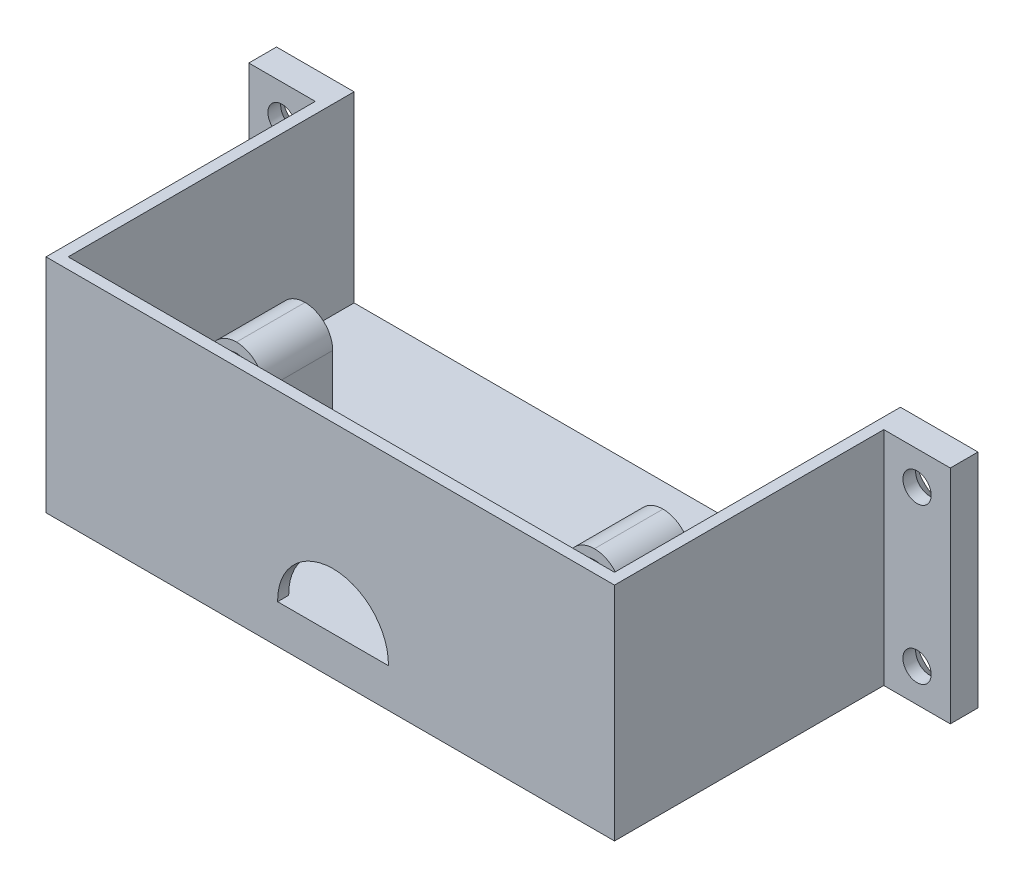
ISO-10303-21;
HEADER;
FILE_DESCRIPTION(('STEP AP214'),'2;1');
FILE_NAME('part.step','',(''),(''),'','','');
FILE_SCHEMA(('AUTOMOTIVE_DESIGN { 1 0 10303 214 1 1 1 1 }'));
ENDSEC;
DATA;
#1=APPLICATION_CONTEXT('core data for automotive mechanical design processes');
#2=APPLICATION_PROTOCOL_DEFINITION('international standard','automotive_design',2000,#1);
#3=PRODUCT_CONTEXT('',#1,'mechanical');
#4=PRODUCT('Part','Part','',(#3));
#5=PRODUCT_RELATED_PRODUCT_CATEGORY('part','',(#4));
#6=PRODUCT_DEFINITION_FORMATION('','',#4);
#7=PRODUCT_DEFINITION_CONTEXT('part definition',#1,'design');
#8=PRODUCT_DEFINITION('design','',#6,#7);
#9=PRODUCT_DEFINITION_SHAPE('','',#8);
#10=(LENGTH_UNIT() NAMED_UNIT(*) SI_UNIT(.MILLI.,.METRE.));
#11=(NAMED_UNIT(*) PLANE_ANGLE_UNIT() SI_UNIT($,.RADIAN.));
#12=(NAMED_UNIT(*) SI_UNIT($,.STERADIAN.) SOLID_ANGLE_UNIT());
#13=UNCERTAINTY_MEASURE_WITH_UNIT(LENGTH_MEASURE(1.E-05),#10,'distance_accuracy_value','');
#14=(GEOMETRIC_REPRESENTATION_CONTEXT(3) GLOBAL_UNCERTAINTY_ASSIGNED_CONTEXT((#13)) GLOBAL_UNIT_ASSIGNED_CONTEXT((#10,
#11,#12)) REPRESENTATION_CONTEXT('',''));
#15=CARTESIAN_POINT('',(0.,0.,0.));
#16=DIRECTION('',(0.,0.,1.));
#17=DIRECTION('',(1.,0.,0.));
#18=AXIS2_PLACEMENT_3D('',#15,#16,#17);
#19=CARTESIAN_POINT('',(0.,0.,-0.0001));
#20=DIRECTION('',(0.,0.,1.));
#21=DIRECTION('',(1.,0.,0.));
#22=AXIS2_PLACEMENT_3D('',#19,#20,#21);
#23=PLANE('',#22);
#24=CARTESIAN_POINT('',(91.1321703939799,13.1867469879518,-0.000100000000001735));
#25=DIRECTION('',(0.,0.,-1.));
#26=DIRECTION('',(-1.,0.,0.));
#27=AXIS2_PLACEMENT_3D('',#24,#25,#26);
#28=CIRCLE('',#27,5.250000041);
#29=CARTESIAN_POINT('',(85.8821703529799,13.1867469879518,-0.000100000000001735));
#30=VERTEX_POINT('',#29);
#31=EDGE_CURVE('E960',#30,#30,#28,.T.);
#32=ORIENTED_EDGE('',*,*,#31,.F.);
#33=EDGE_LOOP('',(#32));
#34=FACE_BOUND('',#33,.T.);
#35=CARTESIAN_POINT('',(-23.4678296060201,13.1867469879518,-0.000100000000001735));
#36=DIRECTION('',(0.,0.,-1.));
#37=DIRECTION('',(-1.,0.,0.));
#38=AXIS2_PLACEMENT_3D('',#35,#36,#37);
#39=CIRCLE('',#38,5.250000041);
#40=CARTESIAN_POINT('',(-28.7178296470201,13.1867469879518,-0.000100000000001735));
#41=VERTEX_POINT('',#40);
#42=EDGE_CURVE('E487',#41,#41,#39,.T.);
#43=ORIENTED_EDGE('',*,*,#42,.F.);
#44=EDGE_LOOP('',(#43));
#45=FACE_BOUND('',#44,.T.);
#46=CARTESIAN_POINT('',(-23.4678296060201,-14.8132530120482,-0.000100000000001735));
#47=DIRECTION('',(0.,0.,-1.));
#48=DIRECTION('',(-1.,0.,0.));
#49=AXIS2_PLACEMENT_3D('',#46,#47,#48);
#50=CIRCLE('',#49,5.250000041);
#51=CARTESIAN_POINT('',(-28.7178296470201,-14.8132530120482,-0.000100000000001735));
#52=VERTEX_POINT('',#51);
#53=EDGE_CURVE('E482',#52,#52,#50,.T.);
#54=ORIENTED_EDGE('',*,*,#53,.F.);
#55=EDGE_LOOP('',(#54));
#56=FACE_BOUND('',#55,.T.);
#57=DIRECTION('',(-1.,0.,0.));
#58=VECTOR('',#57,1.);
#59=CARTESIAN_POINT('',(-17.4678296060201,19.1867469879518,-0.0001));
#60=LINE('',#59,#58);
#61=CARTESIAN_POINT('',(-15.4678296060201,19.1867469879518,-0.0001));
#62=VERTEX_POINT('',#61);
#63=CARTESIAN_POINT('',(-29.4678296060201,19.1867469879518,-0.0001));
#64=VERTEX_POINT('',#63);
#65=EDGE_CURVE('E218',#62,#64,#60,.T.);
#66=ORIENTED_EDGE('',*,*,#65,.F.);
#67=DIRECTION('',(0.,1.,0.));
#68=VECTOR('',#67,1.);
#69=CARTESIAN_POINT('',(-15.4678296060201,-13.8132530120482,-0.0001));
#70=LINE('',#69,#68);
#71=CARTESIAN_POINT('',(-15.4678296060201,-13.8132530120482,-0.0001));
#72=VERTEX_POINT('',#71);
#73=EDGE_CURVE('E407',#72,#62,#70,.T.);
#74=ORIENTED_EDGE('',*,*,#73,.F.);
#75=DIRECTION('',(-1.,0.,0.));
#76=VECTOR('',#75,1.);
#77=CARTESIAN_POINT('',(-15.4678296060201,-13.8132530120482,-0.0001));
#78=LINE('',#77,#76);
#79=CARTESIAN_POINT('',(83.1321703939799,-13.8132530120482,-0.0001));
#80=VERTEX_POINT('',#79);
#81=EDGE_CURVE('E393',#80,#72,#78,.T.);
#82=ORIENTED_EDGE('',*,*,#81,.F.);
#83=DIRECTION('',(0.,1.,0.));
#84=VECTOR('',#83,1.);
#85=CARTESIAN_POINT('',(83.1321703939799,-13.8132530120482,-0.0001));
#86=LINE('',#85,#84);
#87=CARTESIAN_POINT('',(83.1321703939799,19.1867469879518,-0.0001));
#88=VERTEX_POINT('',#87);
#89=EDGE_CURVE('E213',#80,#88,#86,.T.);
#90=ORIENTED_EDGE('',*,*,#89,.T.);
#91=CARTESIAN_POINT('',(97.1321703939799,19.1867469879518,-0.0001));
#92=VERTEX_POINT('',#91);
#93=EDGE_CURVE('E205',#92,#88,#60,.T.);
#94=ORIENTED_EDGE('',*,*,#93,.F.);
#95=DIRECTION('',(0.,1.,0.));
#96=VECTOR('',#95,1.);
#97=CARTESIAN_POINT('',(97.1321703939799,19.1867469879518,-0.0001));
#98=LINE('',#97,#96);
#99=CARTESIAN_POINT('',(97.1321703939799,-20.8132530120482,-0.0001));
#100=VERTEX_POINT('',#99);
#101=EDGE_CURVE('E210',#100,#92,#98,.T.);
#102=ORIENTED_EDGE('',*,*,#101,.F.);
#103=DIRECTION('',(1.,0.,0.));
#104=VECTOR('',#103,1.);
#105=CARTESIAN_POINT('',(85.1321703939799,-20.8132530120482,-0.0001));
#106=LINE('',#105,#104);
#107=CARTESIAN_POINT('',(-29.4678296060201,-20.8132530120482,-0.0001));
#108=VERTEX_POINT('',#107);
#109=EDGE_CURVE('E288',#108,#100,#106,.T.);
#110=ORIENTED_EDGE('',*,*,#109,.F.);
#111=DIRECTION('',(0.,-1.,0.));
#112=VECTOR('',#111,1.);
#113=CARTESIAN_POINT('',(-29.4678296060201,19.1867469879518,-0.0001));
#114=LINE('',#113,#112);
#115=EDGE_CURVE('E254',#64,#108,#114,.T.);
#116=ORIENTED_EDGE('',*,*,#115,.F.);
#117=EDGE_LOOP('',(#66,#74,#82,#90,#94,#102,#110,#116));
#118=FACE_BOUND('',#117,.T.);
#119=CARTESIAN_POINT('',(91.1321703939799,-14.8132530120482,-0.000100000000001735));
#120=DIRECTION('',(0.,0.,-1.));
#121=DIRECTION('',(-1.,0.,0.));
#122=AXIS2_PLACEMENT_3D('',#119,#120,#121);
#123=CIRCLE('',#122,5.250000041);
#124=CARTESIAN_POINT('',(85.8821703529799,-14.8132530120482,-0.000100000000001735));
#125=VERTEX_POINT('',#124);
#126=EDGE_CURVE('E496',#125,#125,#123,.T.);
#127=ORIENTED_EDGE('',*,*,#126,.F.);
#128=EDGE_LOOP('',(#127));
#129=FACE_BOUND('',#128,.T.);
#130=ADVANCED_FACE('F39',(#34,#45,#56,#118,#129),#23,.F.);
#131=CARTESIAN_POINT('',(0.,-13.8132530120482,0.));
#132=DIRECTION('',(0.,-1.,0.));
#133=DIRECTION('',(0.,0.,-1.));
#134=AXIS2_PLACEMENT_3D('',#131,#132,#133);
#135=PLANE('',#134);
#136=DIRECTION('',(0.,0.,1.));
#137=VECTOR('',#136,1.);
#138=CARTESIAN_POINT('',(44.3308215632418,-13.8132530120482,51.5));
#139=LINE('',#138,#137);
#140=CARTESIAN_POINT('',(44.3308215632417,-13.8132530120482,51.5999));
#141=VERTEX_POINT('',#140);
#142=CARTESIAN_POINT('',(44.3308215632418,-13.8132530120482,53.6));
#143=VERTEX_POINT('',#142);
#144=EDGE_CURVE('E299',#141,#143,#139,.T.);
#145=ORIENTED_EDGE('',*,*,#144,.F.);
#146=DIRECTION('',(1.,0.,0.));
#147=VECTOR('',#146,1.);
#148=CARTESIAN_POINT('',(-15.4678296060201,-13.8132530120482,51.5999));
#149=LINE('',#148,#147);
#150=CARTESIAN_POINT('',(83.1321703939799,-13.8132530120482,51.5999));
#151=VERTEX_POINT('',#150);
#152=EDGE_CURVE('E384',#141,#151,#149,.T.);
#153=ORIENTED_EDGE('',*,*,#152,.T.);
#154=DIRECTION('',(0.,0.,-1.));
#155=VECTOR('',#154,1.);
#156=CARTESIAN_POINT('',(83.1321703939799,-13.8132530120482,51.5999));
#157=LINE('',#156,#155);
#158=EDGE_CURVE('E390',#151,#80,#157,.T.);
#159=ORIENTED_EDGE('',*,*,#158,.T.);
#160=ORIENTED_EDGE('',*,*,#81,.T.);
#161=DIRECTION('',(0.,0.,1.));
#162=VECTOR('',#161,1.);
#163=CARTESIAN_POINT('',(-15.4678296060201,-13.8132530120482,51.5999));
#164=LINE('',#163,#162);
#165=CARTESIAN_POINT('',(-15.4678296060201,-13.8132530120482,51.5999));
#166=VERTEX_POINT('',#165);
#167=EDGE_CURVE('E380',#72,#166,#164,.T.);
#168=ORIENTED_EDGE('',*,*,#167,.T.);
#169=CARTESIAN_POINT('',(24.333519224718,-13.8132530120482,51.5999));
#170=VERTEX_POINT('',#169);
#171=EDGE_CURVE('E386',#166,#170,#149,.T.);
#172=ORIENTED_EDGE('',*,*,#171,.T.);
#173=DIRECTION('',(0.,0.,1.));
#174=VECTOR('',#173,1.);
#175=CARTESIAN_POINT('',(24.333519224718,-13.8132530120482,51.5));
#176=LINE('',#175,#174);
#177=CARTESIAN_POINT('',(24.333519224718,-13.8132530120482,53.6));
#178=VERTEX_POINT('',#177);
#179=EDGE_CURVE('E298',#170,#178,#176,.T.);
#180=ORIENTED_EDGE('',*,*,#179,.T.);
#181=DIRECTION('',(1.,0.,0.));
#182=VECTOR('',#181,1.);
#183=CARTESIAN_POINT('',(24.333519224718,-13.8132530120482,53.6));
#184=LINE('',#183,#182);
#185=EDGE_CURVE('E294',#178,#143,#184,.T.);
#186=ORIENTED_EDGE('',*,*,#185,.T.);
#187=EDGE_LOOP('',(#145,#153,#159,#160,#168,#172,#180,#186));
#188=FACE_BOUND('',#187,.T.);
#189=DIRECTION('',(0.,0.,1.));
#190=VECTOR('',#189,1.);
#191=CARTESIAN_POINT('',(-3.46782960602011,-13.8132530120482,25.8499));
#192=LINE('',#191,#190);
#193=CARTESIAN_POINT('',(-3.46782960602011,-13.8132530120482,25.8499));
#194=VERTEX_POINT('',#193);
#195=CARTESIAN_POINT('',(-3.46782960602011,-13.8132530120482,38.2299));
#196=VERTEX_POINT('',#195);
#197=EDGE_CURVE('E351',#194,#196,#192,.T.);
#198=ORIENTED_EDGE('',*,*,#197,.F.);
#199=DIRECTION('',(-1.,0.,0.));
#200=VECTOR('',#199,1.);
#201=CARTESIAN_POINT('',(-3.46782960602011,-13.8132530120482,25.8499));
#202=LINE('',#201,#200);
#203=CARTESIAN_POINT('',(6.53217039397989,-13.8132530120482,25.8499));
#204=VERTEX_POINT('',#203);
#205=EDGE_CURVE('E363',#204,#194,#202,.T.);
#206=ORIENTED_EDGE('',*,*,#205,.F.);
#207=DIRECTION('',(0.,0.,-1.));
#208=VECTOR('',#207,1.);
#209=CARTESIAN_POINT('',(6.53217039397989,-13.8132530120482,25.8499));
#210=LINE('',#209,#208);
#211=CARTESIAN_POINT('',(6.53217039397989,-13.8132530120482,38.2299));
#212=VERTEX_POINT('',#211);
#213=EDGE_CURVE('E359',#212,#204,#210,.T.);
#214=ORIENTED_EDGE('',*,*,#213,.F.);
#215=DIRECTION('',(1.,0.,0.));
#216=VECTOR('',#215,1.);
#217=CARTESIAN_POINT('',(-3.46782960602011,-13.8132530120482,38.2299));
#218=LINE('',#217,#216);
#219=EDGE_CURVE('E355',#196,#212,#218,.T.);
#220=ORIENTED_EDGE('',*,*,#219,.F.);
#221=EDGE_LOOP('',(#198,#206,#214,#220));
#222=FACE_BOUND('',#221,.T.);
#223=DIRECTION('',(0.,0.,1.));
#224=VECTOR('',#223,1.);
#225=CARTESIAN_POINT('',(61.1321703939799,-13.8132530120482,25.8499));
#226=LINE('',#225,#224);
#227=CARTESIAN_POINT('',(61.1321703939799,-13.8132530120482,25.8499));
#228=VERTEX_POINT('',#227);
#229=CARTESIAN_POINT('',(61.1321703939799,-13.8132530120482,38.2299));
#230=VERTEX_POINT('',#229);
#231=EDGE_CURVE('E322',#228,#230,#226,.T.);
#232=ORIENTED_EDGE('',*,*,#231,.F.);
#233=DIRECTION('',(-1.,0.,0.));
#234=VECTOR('',#233,1.);
#235=CARTESIAN_POINT('',(61.1321703939799,-13.8132530120482,25.8499));
#236=LINE('',#235,#234);
#237=CARTESIAN_POINT('',(71.1321703939799,-13.8132530120482,25.8499));
#238=VERTEX_POINT('',#237);
#239=EDGE_CURVE('E335',#238,#228,#236,.T.);
#240=ORIENTED_EDGE('',*,*,#239,.F.);
#241=DIRECTION('',(0.,0.,-1.));
#242=VECTOR('',#241,1.);
#243=CARTESIAN_POINT('',(71.1321703939799,-13.8132530120482,25.8499));
#244=LINE('',#243,#242);
#245=CARTESIAN_POINT('',(71.1321703939799,-13.8132530120482,38.2299));
#246=VERTEX_POINT('',#245);
#247=EDGE_CURVE('E331',#246,#238,#244,.T.);
#248=ORIENTED_EDGE('',*,*,#247,.F.);
#249=DIRECTION('',(1.,0.,0.));
#250=VECTOR('',#249,1.);
#251=CARTESIAN_POINT('',(61.1321703939799,-13.8132530120482,38.2299));
#252=LINE('',#251,#250);
#253=EDGE_CURVE('E326',#230,#246,#252,.T.);
#254=ORIENTED_EDGE('',*,*,#253,.F.);
#255=EDGE_LOOP('',(#232,#240,#248,#254));
#256=FACE_BOUND('',#255,.T.);
#257=ADVANCED_FACE('F531',(#188,#222,#256),#135,.F.);
#258=CARTESIAN_POINT('',(-17.4678296060201,19.1867469879518,-0.0001));
#259=DIRECTION('',(-1.,0.,0.));
#260=DIRECTION('',(0.,0.,1.));
#261=AXIS2_PLACEMENT_3D('',#258,#259,#260);
#262=PLANE('',#261);
#263=DIRECTION('',(0.,1.,0.));
#264=VECTOR('',#263,1.);
#265=CARTESIAN_POINT('',(-17.4678296060201,19.1867469879518,4.9999));
#266=LINE('',#265,#264);
#267=CARTESIAN_POINT('',(-17.4678296060201,-20.8132530120482,4.9999));
#268=VERTEX_POINT('',#267);
#269=CARTESIAN_POINT('',(-17.4678296060201,19.1867469879518,4.9999));
#270=VERTEX_POINT('',#269);
#271=EDGE_CURVE('E65',#268,#270,#266,.T.);
#272=ORIENTED_EDGE('',*,*,#271,.F.);
#273=DIRECTION('',(0.,0.,-1.));
#274=VECTOR('',#273,1.);
#275=CARTESIAN_POINT('',(-17.4678296060201,-20.8132530120482,-0.0001));
#276=LINE('',#275,#274);
#277=CARTESIAN_POINT('',(-17.4678296060201,-20.8132530120482,53.6));
#278=VERTEX_POINT('',#277);
#279=EDGE_CURVE('E285',#278,#268,#276,.T.);
#280=ORIENTED_EDGE('',*,*,#279,.F.);
#281=DIRECTION('',(0.,-1.,0.));
#282=VECTOR('',#281,1.);
#283=CARTESIAN_POINT('',(-17.4678296060201,19.1867469879518,53.6));
#284=LINE('',#283,#282);
#285=CARTESIAN_POINT('',(-17.4678296060201,19.1867469879518,53.6));
#286=VERTEX_POINT('',#285);
#287=EDGE_CURVE('E410',#286,#278,#284,.T.);
#288=ORIENTED_EDGE('',*,*,#287,.F.);
#289=DIRECTION('',(0.,0.,1.));
#290=VECTOR('',#289,1.);
#291=CARTESIAN_POINT('',(-17.4678296060201,19.1867469879518,-0.0001));
#292=LINE('',#291,#290);
#293=EDGE_CURVE('E428',#270,#286,#292,.T.);
#294=ORIENTED_EDGE('',*,*,#293,.F.);
#295=EDGE_LOOP('',(#272,#280,#288,#294));
#296=FACE_BOUND('',#295,.T.);
#297=ADVANCED_FACE('F537',(#296),#262,.T.);
#298=CARTESIAN_POINT('',(-17.4678296060201,19.1867469879518,-0.0001));
#299=DIRECTION('',(0.,1.,0.));
#300=DIRECTION('',(0.,0.,1.));
#301=AXIS2_PLACEMENT_3D('',#298,#299,#300);
#302=PLANE('',#301);
#303=DIRECTION('',(0.,0.,1.));
#304=VECTOR('',#303,1.);
#305=CARTESIAN_POINT('',(-15.4678296060201,19.1867469879518,51.5999));
#306=LINE('',#305,#304);
#307=CARTESIAN_POINT('',(-15.4678296060201,19.1867469879518,51.5999));
#308=VERTEX_POINT('',#307);
#309=EDGE_CURVE('E379',#62,#308,#306,.T.);
#310=ORIENTED_EDGE('',*,*,#309,.F.);
#311=ORIENTED_EDGE('',*,*,#65,.T.);
#312=DIRECTION('',(0.,0.,-1.));
#313=VECTOR('',#312,1.);
#314=CARTESIAN_POINT('',(-29.4678296060201,19.1867469879518,-0.0001));
#315=LINE('',#314,#313);
#316=CARTESIAN_POINT('',(-29.4678296060201,19.1867469879518,4.9999));
#317=VERTEX_POINT('',#316);
#318=EDGE_CURVE('E264',#317,#64,#315,.T.);
#319=ORIENTED_EDGE('',*,*,#318,.F.);
#320=DIRECTION('',(1.,0.,0.));
#321=VECTOR('',#320,1.);
#322=CARTESIAN_POINT('',(-29.4678296060201,19.1867469879518,4.9999));
#323=LINE('',#322,#321);
#324=EDGE_CURVE('E268',#317,#270,#323,.T.);
#325=ORIENTED_EDGE('',*,*,#324,.T.);
#326=ORIENTED_EDGE('',*,*,#293,.T.);
#327=DIRECTION('',(-1.,0.,0.));
#328=VECTOR('',#327,1.);
#329=CARTESIAN_POINT('',(-17.4678296060201,19.1867469879518,53.6));
#330=LINE('',#329,#328);
#331=CARTESIAN_POINT('',(85.1321703939799,19.1867469879518,53.6));
#332=VERTEX_POINT('',#331);
#333=EDGE_CURVE('E424',#332,#286,#330,.T.);
#334=ORIENTED_EDGE('',*,*,#333,.F.);
#335=DIRECTION('',(0.,0.,1.));
#336=VECTOR('',#335,1.);
#337=CARTESIAN_POINT('',(85.1321703939799,19.1867469879518,-0.0001));
#338=LINE('',#337,#336);
#339=CARTESIAN_POINT('',(85.1321703939799,19.1867469879518,4.9999));
#340=VERTEX_POINT('',#339);
#341=EDGE_CURVE('E217',#340,#332,#338,.T.);
#342=ORIENTED_EDGE('',*,*,#341,.F.);
#343=DIRECTION('',(-1.,0.,0.));
#344=VECTOR('',#343,1.);
#345=CARTESIAN_POINT('',(97.1321703939799,19.1867469879518,4.9999));
#346=LINE('',#345,#344);
#347=CARTESIAN_POINT('',(97.1321703939799,19.1867469879518,4.9999));
#348=VERTEX_POINT('',#347);
#349=EDGE_CURVE('E225',#348,#340,#346,.T.);
#350=ORIENTED_EDGE('',*,*,#349,.F.);
#351=DIRECTION('',(0.,0.,1.));
#352=VECTOR('',#351,1.);
#353=CARTESIAN_POINT('',(97.1321703939799,19.1867469879518,-0.0001));
#354=LINE('',#353,#352);
#355=EDGE_CURVE('E221',#92,#348,#354,.T.);
#356=ORIENTED_EDGE('',*,*,#355,.F.);
#357=ORIENTED_EDGE('',*,*,#93,.T.);
#358=DIRECTION('',(0.,0.,-1.));
#359=VECTOR('',#358,1.);
#360=CARTESIAN_POINT('',(83.1321703939799,19.1867469879518,51.5999));
#361=LINE('',#360,#359);
#362=CARTESIAN_POINT('',(83.1321703939799,19.1867469879518,51.5999));
#363=VERTEX_POINT('',#362);
#364=EDGE_CURVE('E385',#363,#88,#361,.T.);
#365=ORIENTED_EDGE('',*,*,#364,.F.);
#366=DIRECTION('',(1.,0.,0.));
#367=VECTOR('',#366,1.);
#368=CARTESIAN_POINT('',(-15.4678296060201,19.1867469879518,51.5999));
#369=LINE('',#368,#367);
#370=EDGE_CURVE('E401',#308,#363,#369,.T.);
#371=ORIENTED_EDGE('',*,*,#370,.F.);
#372=EDGE_LOOP('',(#310,#311,#319,#325,#326,#334,#342,#350,#356,#357,#365,#371));
#373=FACE_BOUND('',#372,.T.);
#374=ADVANCED_FACE('F223',(#373),#302,.T.);
#375=CARTESIAN_POINT('',(85.1321703939799,19.1867469879518,-0.0001));
#376=DIRECTION('',(1.,0.,0.));
#377=DIRECTION('',(0.,0.,-1.));
#378=AXIS2_PLACEMENT_3D('',#375,#376,#377);
#379=PLANE('',#378);
#380=DIRECTION('',(0.,-1.,0.));
#381=VECTOR('',#380,1.);
#382=CARTESIAN_POINT('',(85.1321703939799,19.1867469879518,4.9999));
#383=LINE('',#382,#381);
#384=CARTESIAN_POINT('',(85.1321703939799,-20.8132530120482,4.99989999999999));
#385=VERTEX_POINT('',#384);
#386=EDGE_CURVE('E57',#340,#385,#383,.T.);
#387=ORIENTED_EDGE('',*,*,#386,.F.);
#388=ORIENTED_EDGE('',*,*,#341,.T.);
#389=DIRECTION('',(0.,1.,0.));
#390=VECTOR('',#389,1.);
#391=CARTESIAN_POINT('',(85.1321703939799,19.1867469879518,53.6));
#392=LINE('',#391,#390);
#393=CARTESIAN_POINT('',(85.1321703939799,-20.8132530120482,53.6));
#394=VERTEX_POINT('',#393);
#395=EDGE_CURVE('E420',#394,#332,#392,.T.);
#396=ORIENTED_EDGE('',*,*,#395,.F.);
#397=DIRECTION('',(0.,0.,1.));
#398=VECTOR('',#397,1.);
#399=CARTESIAN_POINT('',(85.1321703939799,-20.8132530120482,-0.0001));
#400=LINE('',#399,#398);
#401=EDGE_CURVE('E278',#385,#394,#400,.T.);
#402=ORIENTED_EDGE('',*,*,#401,.F.);
#403=EDGE_LOOP('',(#387,#388,#396,#402));
#404=FACE_BOUND('',#403,.T.);
#405=ADVANCED_FACE('F548',(#404),#379,.T.);
#406=CARTESIAN_POINT('',(0.,0.,53.6));
#407=DIRECTION('',(0.,0.,1.));
#408=DIRECTION('',(1.,0.,0.));
#409=AXIS2_PLACEMENT_3D('',#406,#407,#408);
#410=PLANE('',#409);
#411=CARTESIAN_POINT('',(34.3321703939799,-13.6433006286747,53.6));
#412=DIRECTION('',(0.,0.,1.));
#413=DIRECTION('',(1.,0.,0.));
#414=AXIS2_PLACEMENT_3D('',#411,#412,#413);
#415=CIRCLE('',#414,10.0000954504043);
#416=EDGE_CURVE('E291',#143,#178,#415,.T.);
#417=ORIENTED_EDGE('',*,*,#416,.F.);
#418=ORIENTED_EDGE('',*,*,#185,.F.);
#419=EDGE_LOOP('',(#417,#418));
#420=FACE_BOUND('',#419,.T.);
#421=ORIENTED_EDGE('',*,*,#287,.T.);
#422=DIRECTION('',(-1.,0.,0.));
#423=VECTOR('',#422,1.);
#424=CARTESIAN_POINT('',(85.1321703939799,-20.8132530120482,53.6));
#425=LINE('',#424,#423);
#426=EDGE_CURVE('E281',#394,#278,#425,.T.);
#427=ORIENTED_EDGE('',*,*,#426,.F.);
#428=ORIENTED_EDGE('',*,*,#395,.T.);
#429=ORIENTED_EDGE('',*,*,#333,.T.);
#430=EDGE_LOOP('',(#421,#427,#428,#429));
#431=FACE_BOUND('',#430,.T.);
#432=ADVANCED_FACE('F544',(#420,#431),#410,.T.);
#433=CARTESIAN_POINT('',(-15.4678296060201,-13.8132530120482,51.5999));
#434=DIRECTION('',(-1.,0.,0.));
#435=DIRECTION('',(0.,0.,1.));
#436=AXIS2_PLACEMENT_3D('',#433,#434,#435);
#437=PLANE('',#436);
#438=ORIENTED_EDGE('',*,*,#309,.T.);
#439=DIRECTION('',(0.,1.,0.));
#440=VECTOR('',#439,1.);
#441=CARTESIAN_POINT('',(-15.4678296060201,-13.8132530120482,51.5999));
#442=LINE('',#441,#440);
#443=EDGE_CURVE('E397',#166,#308,#442,.T.);
#444=ORIENTED_EDGE('',*,*,#443,.F.);
#445=ORIENTED_EDGE('',*,*,#167,.F.);
#446=ORIENTED_EDGE('',*,*,#73,.T.);
#447=EDGE_LOOP('',(#438,#444,#445,#446));
#448=FACE_BOUND('',#447,.T.);
#449=ADVANCED_FACE('F630',(#448),#437,.F.);
#450=CARTESIAN_POINT('',(83.1321703939799,-13.8132530120482,51.5999));
#451=DIRECTION('',(1.,0.,0.));
#452=DIRECTION('',(0.,0.,-1.));
#453=AXIS2_PLACEMENT_3D('',#450,#451,#452);
#454=PLANE('',#453);
#455=ORIENTED_EDGE('',*,*,#364,.T.);
#456=ORIENTED_EDGE('',*,*,#89,.F.);
#457=ORIENTED_EDGE('',*,*,#158,.F.);
#458=DIRECTION('',(0.,1.,0.));
#459=VECTOR('',#458,1.);
#460=CARTESIAN_POINT('',(83.1321703939799,-13.8132530120482,51.5999));
#461=LINE('',#460,#459);
#462=EDGE_CURVE('E413',#151,#363,#461,.T.);
#463=ORIENTED_EDGE('',*,*,#462,.T.);
#464=EDGE_LOOP('',(#455,#456,#457,#463));
#465=FACE_BOUND('',#464,.T.);
#466=ADVANCED_FACE('F627',(#465),#454,.F.);
#467=CARTESIAN_POINT('',(-15.4678296060201,-13.8132530120482,51.5999));
#468=DIRECTION('',(0.,0.,1.));
#469=DIRECTION('',(1.,0.,0.));
#470=AXIS2_PLACEMENT_3D('',#467,#468,#469);
#471=PLANE('',#470);
#472=ORIENTED_EDGE('',*,*,#152,.F.);
#473=CARTESIAN_POINT('',(34.3321703939799,-13.6433006286747,51.5999));
#474=DIRECTION('',(0.,0.,1.));
#475=DIRECTION('',(1.,0.,0.));
#476=AXIS2_PLACEMENT_3D('',#473,#474,#475);
#477=CIRCLE('',#476,10.0000954504043);
#478=EDGE_CURVE('E11',#141,#170,#477,.T.);
#479=ORIENTED_EDGE('',*,*,#478,.T.);
#480=ORIENTED_EDGE('',*,*,#171,.F.);
#481=ORIENTED_EDGE('',*,*,#443,.T.);
#482=ORIENTED_EDGE('',*,*,#370,.T.);
#483=ORIENTED_EDGE('',*,*,#462,.F.);
#484=EDGE_LOOP('',(#472,#479,#480,#481,#482,#483));
#485=FACE_BOUND('',#484,.T.);
#486=ADVANCED_FACE('F624',(#485),#471,.F.);
#487=CARTESIAN_POINT('',(-3.46782960602011,7.68674698795181,25.8499));
#488=DIRECTION('',(1.,0.,0.));
#489=DIRECTION('',(0.,0.,-1.));
#490=AXIS2_PLACEMENT_3D('',#487,#488,#489);
#491=PLANE('',#490);
#492=DIRECTION('',(0.,-1.,0.));
#493=VECTOR('',#492,1.);
#494=CARTESIAN_POINT('',(-3.46782960602011,7.68674698795181,38.2299));
#495=LINE('',#494,#493);
#496=CARTESIAN_POINT('',(-3.46782960602011,2.6867469879518,38.2299));
#497=VERTEX_POINT('',#496);
#498=EDGE_CURVE('E376',#497,#196,#495,.T.);
#499=ORIENTED_EDGE('',*,*,#498,.F.);
#500=DIRECTION('',(0.,0.,1.));
#501=VECTOR('',#500,1.);
#502=CARTESIAN_POINT('',(-3.46782960602011,2.6867469879518,25.8499));
#503=LINE('',#502,#501);
#504=CARTESIAN_POINT('',(-3.46782960602011,2.6867469879518,25.8499));
#505=VERTEX_POINT('',#504);
#506=EDGE_CURVE('E439',#497,#505,#503,.F.);
#507=ORIENTED_EDGE('',*,*,#506,.T.);
#508=DIRECTION('',(0.,-1.,0.));
#509=VECTOR('',#508,1.);
#510=CARTESIAN_POINT('',(-3.46782960602011,7.68674698795181,25.8499));
#511=LINE('',#510,#509);
#512=EDGE_CURVE('E367',#505,#194,#511,.T.);
#513=ORIENTED_EDGE('',*,*,#512,.T.);
#514=ORIENTED_EDGE('',*,*,#197,.T.);
#515=EDGE_LOOP('',(#499,#507,#513,#514));
#516=FACE_BOUND('',#515,.T.);
#517=ADVANCED_FACE('F621',(#516),#491,.F.);
#518=CARTESIAN_POINT('',(-3.46782960602011,7.68674698795181,38.2299));
#519=DIRECTION('',(0.,0.,-1.));
#520=DIRECTION('',(-1.,0.,0.));
#521=AXIS2_PLACEMENT_3D('',#518,#519,#520);
#522=PLANE('',#521);
#523=CARTESIAN_POINT('',(1.53217039397988,2.1867469879518,38.2299));
#524=DIRECTION('',(0.,0.,-1.));
#525=DIRECTION('',(-1.,0.,0.));
#526=AXIS2_PLACEMENT_3D('',#523,#524,#525);
#527=CIRCLE('',#526,3.75);
#528=CARTESIAN_POINT('',(-2.21782960602012,2.1867469879518,38.2299));
#529=VERTEX_POINT('',#528);
#530=EDGE_CURVE('E317',#529,#529,#527,.T.);
#531=ORIENTED_EDGE('',*,*,#530,.T.);
#532=EDGE_LOOP('',(#531));
#533=FACE_BOUND('',#532,.T.);
#534=CARTESIAN_POINT('',(1.53217039397989,2.6867469879518,38.2299));
#535=DIRECTION('',(0.,0.,-1.));
#536=DIRECTION('',(-1.,0.,0.));
#537=AXIS2_PLACEMENT_3D('',#534,#535,#536);
#538=CIRCLE('',#537,5.);
#539=CARTESIAN_POINT('',(6.53217039397989,2.6867469879518,38.2299));
#540=VERTEX_POINT('',#539);
#541=CARTESIAN_POINT('',(1.53217039397989,7.68674698795181,38.2299));
#542=VERTEX_POINT('',#541);
#543=EDGE_CURVE('E431',#540,#542,#538,.F.);
#544=ORIENTED_EDGE('',*,*,#543,.T.);
#545=CARTESIAN_POINT('',(1.53217039397989,2.6867469879518,38.2299));
#546=DIRECTION('',(0.,0.,-1.));
#547=DIRECTION('',(-1.,0.,0.));
#548=AXIS2_PLACEMENT_3D('',#545,#546,#547);
#549=CIRCLE('',#548,5.);
#550=EDGE_CURVE('E436',#542,#497,#549,.F.);
#551=ORIENTED_EDGE('',*,*,#550,.T.);
#552=ORIENTED_EDGE('',*,*,#498,.T.);
#553=ORIENTED_EDGE('',*,*,#219,.T.);
#554=DIRECTION('',(0.,-1.,0.));
#555=VECTOR('',#554,1.);
#556=CARTESIAN_POINT('',(6.53217039397989,7.68674698795181,38.2299));
#557=LINE('',#556,#555);
#558=EDGE_CURVE('E373',#540,#212,#557,.T.);
#559=ORIENTED_EDGE('',*,*,#558,.F.);
#560=EDGE_LOOP('',(#544,#551,#552,#553,#559));
#561=FACE_BOUND('',#560,.T.);
#562=ADVANCED_FACE('F617',(#533,#561),#522,.F.);
#563=CARTESIAN_POINT('',(6.53217039397989,7.68674698795181,25.8499));
#564=DIRECTION('',(-1.,0.,0.));
#565=DIRECTION('',(0.,0.,1.));
#566=AXIS2_PLACEMENT_3D('',#563,#564,#565);
#567=PLANE('',#566);
#568=DIRECTION('',(0.,-1.,0.));
#569=VECTOR('',#568,1.);
#570=CARTESIAN_POINT('',(6.53217039397989,7.68674698795181,25.8499));
#571=LINE('',#570,#569);
#572=CARTESIAN_POINT('',(6.53217039397989,2.6867469879518,25.8499));
#573=VERTEX_POINT('',#572);
#574=EDGE_CURVE('E370',#573,#204,#571,.T.);
#575=ORIENTED_EDGE('',*,*,#574,.F.);
#576=DIRECTION('',(0.,0.,-1.));
#577=VECTOR('',#576,1.);
#578=CARTESIAN_POINT('',(6.53217039397989,2.6867469879518,38.2299));
#579=LINE('',#578,#577);
#580=EDGE_CURVE('E449',#573,#540,#579,.F.);
#581=ORIENTED_EDGE('',*,*,#580,.T.);
#582=ORIENTED_EDGE('',*,*,#558,.T.);
#583=ORIENTED_EDGE('',*,*,#213,.T.);
#584=EDGE_LOOP('',(#575,#581,#582,#583));
#585=FACE_BOUND('',#584,.T.);
#586=ADVANCED_FACE('F613',(#585),#567,.F.);
#587=CARTESIAN_POINT('',(-3.46782960602011,7.68674698795181,25.8499));
#588=DIRECTION('',(0.,0.,1.));
#589=DIRECTION('',(1.,0.,0.));
#590=AXIS2_PLACEMENT_3D('',#587,#588,#589);
#591=PLANE('',#590);
#592=CARTESIAN_POINT('',(1.53217039397988,2.1867469879518,25.8499));
#593=DIRECTION('',(0.,0.,-1.));
#594=DIRECTION('',(-1.,0.,0.));
#595=AXIS2_PLACEMENT_3D('',#592,#593,#594);
#596=CIRCLE('',#595,3.75);
#597=CARTESIAN_POINT('',(-2.21782960602012,2.1867469879518,25.8499));
#598=VERTEX_POINT('',#597);
#599=EDGE_CURVE('E302',#598,#598,#596,.T.);
#600=ORIENTED_EDGE('',*,*,#599,.F.);
#601=EDGE_LOOP('',(#600));
#602=FACE_BOUND('',#601,.T.);
#603=ORIENTED_EDGE('',*,*,#512,.F.);
#604=CARTESIAN_POINT('',(1.53217039397989,2.6867469879518,25.8499));
#605=DIRECTION('',(0.,0.,1.));
#606=DIRECTION('',(1.,0.,0.));
#607=AXIS2_PLACEMENT_3D('',#604,#605,#606);
#608=CIRCLE('',#607,5.);
#609=CARTESIAN_POINT('',(1.53217039397989,7.68674698795181,25.8499));
#610=VERTEX_POINT('',#609);
#611=EDGE_CURVE('E446',#505,#610,#608,.F.);
#612=ORIENTED_EDGE('',*,*,#611,.T.);
#613=CARTESIAN_POINT('',(1.53217039397989,2.6867469879518,25.8499));
#614=DIRECTION('',(0.,0.,1.));
#615=DIRECTION('',(1.,0.,0.));
#616=AXIS2_PLACEMENT_3D('',#613,#614,#615);
#617=CIRCLE('',#616,5.);
#618=EDGE_CURVE('E443',#610,#573,#617,.F.);
#619=ORIENTED_EDGE('',*,*,#618,.T.);
#620=ORIENTED_EDGE('',*,*,#574,.T.);
#621=ORIENTED_EDGE('',*,*,#205,.T.);
#622=EDGE_LOOP('',(#603,#612,#619,#620,#621));
#623=FACE_BOUND('',#622,.T.);
#624=ADVANCED_FACE('F610',(#602,#623),#591,.F.);
#625=CARTESIAN_POINT('',(61.1321703939799,7.68674698795181,25.8499));
#626=DIRECTION('',(1.,0.,0.));
#627=DIRECTION('',(0.,0.,-1.));
#628=AXIS2_PLACEMENT_3D('',#625,#626,#627);
#629=PLANE('',#628);
#630=DIRECTION('',(0.,-1.,0.));
#631=VECTOR('',#630,1.);
#632=CARTESIAN_POINT('',(61.1321703939799,7.68674698795181,38.2299));
#633=LINE('',#632,#631);
#634=CARTESIAN_POINT('',(61.1321703939799,2.6867469879518,38.2299));
#635=VERTEX_POINT('',#634);
#636=EDGE_CURVE('E348',#635,#230,#633,.T.);
#637=ORIENTED_EDGE('',*,*,#636,.F.);
#638=DIRECTION('',(0.,0.,1.));
#639=VECTOR('',#638,1.);
#640=CARTESIAN_POINT('',(61.1321703939799,2.6867469879518,25.8499));
#641=LINE('',#640,#639);
#642=CARTESIAN_POINT('',(61.1321703939799,2.6867469879518,25.8499));
#643=VERTEX_POINT('',#642);
#644=EDGE_CURVE('E49',#635,#643,#641,.F.);
#645=ORIENTED_EDGE('',*,*,#644,.T.);
#646=DIRECTION('',(0.,-1.,0.));
#647=VECTOR('',#646,1.);
#648=CARTESIAN_POINT('',(61.1321703939799,7.68674698795181,25.8499));
#649=LINE('',#648,#647);
#650=EDGE_CURVE('E339',#643,#228,#649,.T.);
#651=ORIENTED_EDGE('',*,*,#650,.T.);
#652=ORIENTED_EDGE('',*,*,#231,.T.);
#653=EDGE_LOOP('',(#637,#645,#651,#652));
#654=FACE_BOUND('',#653,.T.);
#655=ADVANCED_FACE('F590',(#654),#629,.F.);
#656=CARTESIAN_POINT('',(61.1321703939799,7.68674698795181,38.2299));
#657=DIRECTION('',(0.,0.,-1.));
#658=DIRECTION('',(-1.,0.,0.));
#659=AXIS2_PLACEMENT_3D('',#656,#657,#658);
#660=PLANE('',#659);
#661=CARTESIAN_POINT('',(66.1321703939799,2.18674698795181,38.2299));
#662=DIRECTION('',(0.,0.,-1.));
#663=DIRECTION('',(-1.,0.,0.));
#664=AXIS2_PLACEMENT_3D('',#661,#662,#663);
#665=CIRCLE('',#664,3.75000000000001);
#666=CARTESIAN_POINT('',(62.3821703939799,2.18674698795181,38.2299));
#667=VERTEX_POINT('',#666);
#668=EDGE_CURVE('E310',#667,#667,#665,.T.);
#669=ORIENTED_EDGE('',*,*,#668,.T.);
#670=EDGE_LOOP('',(#669));
#671=FACE_BOUND('',#670,.T.);
#672=DIRECTION('',(0.,-1.,0.));
#673=VECTOR('',#672,1.);
#674=CARTESIAN_POINT('',(71.1321703939799,7.68674698795181,38.2299));
#675=LINE('',#674,#673);
#676=CARTESIAN_POINT('',(71.1321703939799,2.6867469879518,38.2299));
#677=VERTEX_POINT('',#676);
#678=EDGE_CURVE('E345',#677,#246,#675,.T.);
#679=ORIENTED_EDGE('',*,*,#678,.F.);
#680=CARTESIAN_POINT('',(66.1321703939799,2.6867469879518,38.2299));
#681=DIRECTION('',(0.,0.,-1.));
#682=DIRECTION('',(-1.,0.,0.));
#683=AXIS2_PLACEMENT_3D('',#680,#681,#682);
#684=CIRCLE('',#683,5.);
#685=CARTESIAN_POINT('',(66.1321703939799,7.68674698795181,38.2299));
#686=VERTEX_POINT('',#685);
#687=EDGE_CURVE('E465',#677,#686,#684,.F.);
#688=ORIENTED_EDGE('',*,*,#687,.T.);
#689=CARTESIAN_POINT('',(66.1321703939799,2.6867469879518,38.2299));
#690=DIRECTION('',(0.,0.,-1.));
#691=DIRECTION('',(-1.,0.,0.));
#692=AXIS2_PLACEMENT_3D('',#689,#690,#691);
#693=CIRCLE('',#692,5.);
#694=EDGE_CURVE('E462',#686,#635,#693,.F.);
#695=ORIENTED_EDGE('',*,*,#694,.T.);
#696=ORIENTED_EDGE('',*,*,#636,.T.);
#697=ORIENTED_EDGE('',*,*,#253,.T.);
#698=EDGE_LOOP('',(#679,#688,#695,#696,#697));
#699=FACE_BOUND('',#698,.T.);
#700=ADVANCED_FACE('F583',(#671,#699),#660,.F.);
#701=CARTESIAN_POINT('',(71.1321703939799,7.68674698795181,25.8499));
#702=DIRECTION('',(-1.,0.,0.));
#703=DIRECTION('',(0.,0.,1.));
#704=AXIS2_PLACEMENT_3D('',#701,#702,#703);
#705=PLANE('',#704);
#706=DIRECTION('',(0.,-1.,0.));
#707=VECTOR('',#706,1.);
#708=CARTESIAN_POINT('',(71.1321703939799,7.68674698795181,25.8499));
#709=LINE('',#708,#707);
#710=CARTESIAN_POINT('',(71.1321703939799,2.6867469879518,25.8499));
#711=VERTEX_POINT('',#710);
#712=EDGE_CURVE('E342',#711,#238,#709,.T.);
#713=ORIENTED_EDGE('',*,*,#712,.F.);
#714=DIRECTION('',(0.,0.,-1.));
#715=VECTOR('',#714,1.);
#716=CARTESIAN_POINT('',(71.1321703939799,2.6867469879518,38.2299));
#717=LINE('',#716,#715);
#718=EDGE_CURVE('E458',#711,#677,#717,.F.);
#719=ORIENTED_EDGE('',*,*,#718,.T.);
#720=ORIENTED_EDGE('',*,*,#678,.T.);
#721=ORIENTED_EDGE('',*,*,#247,.T.);
#722=EDGE_LOOP('',(#713,#719,#720,#721));
#723=FACE_BOUND('',#722,.T.);
#724=ADVANCED_FACE('F581',(#723),#705,.F.);
#725=CARTESIAN_POINT('',(61.1321703939799,7.68674698795181,25.8499));
#726=DIRECTION('',(0.,0.,1.));
#727=DIRECTION('',(1.,0.,0.));
#728=AXIS2_PLACEMENT_3D('',#725,#726,#727);
#729=PLANE('',#728);
#730=CARTESIAN_POINT('',(66.1321703939799,2.18674698795181,25.8499));
#731=DIRECTION('',(0.,0.,-1.));
#732=DIRECTION('',(-1.,0.,0.));
#733=AXIS2_PLACEMENT_3D('',#730,#731,#732);
#734=CIRCLE('',#733,3.75000000000001);
#735=CARTESIAN_POINT('',(62.3821703939799,2.18674698795181,25.8499));
#736=VERTEX_POINT('',#735);
#737=EDGE_CURVE('E306',#736,#736,#734,.T.);
#738=ORIENTED_EDGE('',*,*,#737,.F.);
#739=EDGE_LOOP('',(#738));
#740=FACE_BOUND('',#739,.T.);
#741=CARTESIAN_POINT('',(66.1321703939799,2.6867469879518,25.8499));
#742=DIRECTION('',(0.,0.,1.));
#743=DIRECTION('',(1.,0.,0.));
#744=AXIS2_PLACEMENT_3D('',#741,#742,#743);
#745=CIRCLE('',#744,5.);
#746=CARTESIAN_POINT('',(66.1321703939799,7.68674698795181,25.8499));
#747=VERTEX_POINT('',#746);
#748=EDGE_CURVE('E452',#643,#747,#745,.F.);
#749=ORIENTED_EDGE('',*,*,#748,.T.);
#750=CARTESIAN_POINT('',(66.1321703939799,2.6867469879518,25.8499));
#751=DIRECTION('',(0.,0.,1.));
#752=DIRECTION('',(1.,0.,0.));
#753=AXIS2_PLACEMENT_3D('',#750,#751,#752);
#754=CIRCLE('',#753,5.);
#755=EDGE_CURVE('E455',#747,#711,#754,.F.);
#756=ORIENTED_EDGE('',*,*,#755,.T.);
#757=ORIENTED_EDGE('',*,*,#712,.T.);
#758=ORIENTED_EDGE('',*,*,#239,.T.);
#759=ORIENTED_EDGE('',*,*,#650,.F.);
#760=EDGE_LOOP('',(#749,#756,#757,#758,#759));
#761=FACE_BOUND('',#760,.T.);
#762=ADVANCED_FACE('F559',(#740,#761),#729,.F.);
#763=CARTESIAN_POINT('',(1.53217039397988,2.6867469879518,0.));
#764=DIRECTION('',(0.,0.,1.));
#765=DIRECTION('',(1.,0.,0.));
#766=AXIS2_PLACEMENT_3D('',#763,#764,#765);
#767=CYLINDRICAL_SURFACE('',#766,5.);
#768=ORIENTED_EDGE('',*,*,#580,.F.);
#769=ORIENTED_EDGE('',*,*,#618,.F.);
#770=DIRECTION('',(0.,0.,-1.));
#771=VECTOR('',#770,1.);
#772=CARTESIAN_POINT('',(1.53217039397989,7.68674698795181,25.8499));
#773=LINE('',#772,#771);
#774=EDGE_CURVE('E327',#542,#610,#773,.T.);
#775=ORIENTED_EDGE('',*,*,#774,.F.);
#776=ORIENTED_EDGE('',*,*,#543,.F.);
#777=EDGE_LOOP('',(#768,#769,#775,#776));
#778=FACE_BOUND('',#777,.T.);
#779=ADVANCED_FACE('F556',(#778),#767,.T.);
#780=CARTESIAN_POINT('',(1.53217039397989,2.6867469879518,0.));
#781=DIRECTION('',(0.,0.,-1.));
#782=DIRECTION('',(-1.,0.,0.));
#783=AXIS2_PLACEMENT_3D('',#780,#781,#782);
#784=CYLINDRICAL_SURFACE('',#783,5.);
#785=ORIENTED_EDGE('',*,*,#611,.F.);
#786=ORIENTED_EDGE('',*,*,#506,.F.);
#787=ORIENTED_EDGE('',*,*,#550,.F.);
#788=ORIENTED_EDGE('',*,*,#774,.T.);
#789=EDGE_LOOP('',(#785,#786,#787,#788));
#790=FACE_BOUND('',#789,.T.);
#791=ADVANCED_FACE('F553',(#790),#784,.T.);
#792=CARTESIAN_POINT('',(66.1321703939799,2.6867469879518,0.));
#793=DIRECTION('',(0.,0.,-1.));
#794=DIRECTION('',(-1.,0.,0.));
#795=AXIS2_PLACEMENT_3D('',#792,#793,#794);
#796=CYLINDRICAL_SURFACE('',#795,5.);
#797=ORIENTED_EDGE('',*,*,#644,.F.);
#798=ORIENTED_EDGE('',*,*,#694,.F.);
#799=DIRECTION('',(0.,0.,1.));
#800=VECTOR('',#799,1.);
#801=CARTESIAN_POINT('',(66.1321703939799,7.68674698795181,38.2299));
#802=LINE('',#801,#800);
#803=EDGE_CURVE('E321',#747,#686,#802,.T.);
#804=ORIENTED_EDGE('',*,*,#803,.F.);
#805=ORIENTED_EDGE('',*,*,#748,.F.);
#806=EDGE_LOOP('',(#797,#798,#804,#805));
#807=FACE_BOUND('',#806,.T.);
#808=ADVANCED_FACE('F41',(#807),#796,.T.);
#809=CARTESIAN_POINT('',(66.1321703939799,2.6867469879518,0.));
#810=DIRECTION('',(0.,0.,1.));
#811=DIRECTION('',(1.,0.,0.));
#812=AXIS2_PLACEMENT_3D('',#809,#810,#811);
#813=CYLINDRICAL_SURFACE('',#812,5.);
#814=ORIENTED_EDGE('',*,*,#687,.F.);
#815=ORIENTED_EDGE('',*,*,#718,.F.);
#816=ORIENTED_EDGE('',*,*,#755,.F.);
#817=ORIENTED_EDGE('',*,*,#803,.T.);
#818=EDGE_LOOP('',(#814,#815,#816,#817));
#819=FACE_BOUND('',#818,.T.);
#820=ADVANCED_FACE('F561',(#819),#813,.T.);
#821=CARTESIAN_POINT('',(66.1321703939799,2.18674698795181,40.8499));
#822=DIRECTION('',(0.,0.,-1.));
#823=DIRECTION('',(-1.,0.,0.));
#824=AXIS2_PLACEMENT_3D('',#821,#822,#823);
#825=CYLINDRICAL_SURFACE('',#824,3.75000000000001);
#826=ORIENTED_EDGE('',*,*,#737,.T.);
#827=EDGE_LOOP('',(#826));
#828=FACE_BOUND('',#827,.T.);
#829=ORIENTED_EDGE('',*,*,#668,.F.);
#830=EDGE_LOOP('',(#829));
#831=FACE_BOUND('',#830,.T.);
#832=ADVANCED_FACE('F563',(#828,#831),#825,.F.);
#833=CARTESIAN_POINT('',(1.53217039397988,2.1867469879518,40.8499));
#834=DIRECTION('',(0.,0.,-1.));
#835=DIRECTION('',(-1.,0.,0.));
#836=AXIS2_PLACEMENT_3D('',#833,#834,#835);
#837=CYLINDRICAL_SURFACE('',#836,3.75);
#838=ORIENTED_EDGE('',*,*,#599,.T.);
#839=EDGE_LOOP('',(#838));
#840=FACE_BOUND('',#839,.T.);
#841=ORIENTED_EDGE('',*,*,#530,.F.);
#842=EDGE_LOOP('',(#841));
#843=FACE_BOUND('',#842,.T.);
#844=ADVANCED_FACE('F569',(#840,#843),#837,.F.);
#845=CARTESIAN_POINT('',(34.3321703939799,-13.6433006286747,51.5));
#846=DIRECTION('',(0.,0.,1.));
#847=DIRECTION('',(1.,0.,0.));
#848=AXIS2_PLACEMENT_3D('',#845,#846,#847);
#849=CYLINDRICAL_SURFACE('',#848,10.0000954504043);
#850=ORIENTED_EDGE('',*,*,#144,.T.);
#851=ORIENTED_EDGE('',*,*,#416,.T.);
#852=ORIENTED_EDGE('',*,*,#179,.F.);
#853=ORIENTED_EDGE('',*,*,#478,.F.);
#854=EDGE_LOOP('',(#850,#851,#852,#853));
#855=FACE_BOUND('',#854,.T.);
#856=ADVANCED_FACE('F655',(#855),#849,.F.);
#857=CARTESIAN_POINT('',(0.,-20.8132530120482,0.));
#858=DIRECTION('',(0.,-1.,0.));
#859=DIRECTION('',(0.,0.,-1.));
#860=AXIS2_PLACEMENT_3D('',#857,#858,#859);
#861=PLANE('',#860);
#862=ORIENTED_EDGE('',*,*,#109,.T.);
#863=DIRECTION('',(0.,0.,-1.));
#864=VECTOR('',#863,1.);
#865=CARTESIAN_POINT('',(97.1321703939799,-20.8132530120482,-0.0001));
#866=LINE('',#865,#864);
#867=CARTESIAN_POINT('',(97.1321703939799,-20.8132530120482,4.99989999999999));
#868=VERTEX_POINT('',#867);
#869=EDGE_CURVE('E234',#868,#100,#866,.T.);
#870=ORIENTED_EDGE('',*,*,#869,.F.);
#871=DIRECTION('',(-1.,0.,0.));
#872=VECTOR('',#871,1.);
#873=CARTESIAN_POINT('',(97.1321703939799,-20.8132530120482,4.99989999999999));
#874=LINE('',#873,#872);
#875=EDGE_CURVE('E247',#868,#385,#874,.T.);
#876=ORIENTED_EDGE('',*,*,#875,.T.);
#877=ORIENTED_EDGE('',*,*,#401,.T.);
#878=ORIENTED_EDGE('',*,*,#426,.T.);
#879=ORIENTED_EDGE('',*,*,#279,.T.);
#880=DIRECTION('',(1.,0.,0.));
#881=VECTOR('',#880,1.);
#882=CARTESIAN_POINT('',(-29.4678296060201,-20.8132530120482,4.99990000000001));
#883=LINE('',#882,#881);
#884=CARTESIAN_POINT('',(-29.4678296060201,-20.8132530120482,4.99990000000001));
#885=VERTEX_POINT('',#884);
#886=EDGE_CURVE('E274',#885,#268,#883,.T.);
#887=ORIENTED_EDGE('',*,*,#886,.F.);
#888=DIRECTION('',(0.,0.,1.));
#889=VECTOR('',#888,1.);
#890=CARTESIAN_POINT('',(-29.4678296060201,-20.8132530120482,-0.0001));
#891=LINE('',#890,#889);
#892=EDGE_CURVE('E258',#108,#885,#891,.T.);
#893=ORIENTED_EDGE('',*,*,#892,.F.);
#894=EDGE_LOOP('',(#862,#870,#876,#877,#878,#879,#887,#893));
#895=FACE_BOUND('',#894,.T.);
#896=ADVANCED_FACE('F661',(#895),#861,.T.);
#897=CARTESIAN_POINT('',(-29.4678296060201,19.1867469879518,4.9999));
#898=DIRECTION('',(0.,0.,-1.));
#899=DIRECTION('',(0.,1.,0.));
#900=AXIS2_PLACEMENT_3D('',#897,#898,#899);
#901=PLANE('',#900);
#902=CARTESIAN_POINT('',(-23.4678296060201,13.1867469879518,4.9999));
#903=DIRECTION('',(0.,0.,-1.));
#904=DIRECTION('',(0.,1.,0.));
#905=AXIS2_PLACEMENT_3D('',#902,#903,#904);
#906=CIRCLE('',#905,2.54999998);
#907=CARTESIAN_POINT('',(-23.4678296060201,15.7367469679518,4.9999));
#908=VERTEX_POINT('',#907);
#909=EDGE_CURVE('E479',#908,#908,#906,.T.);
#910=ORIENTED_EDGE('',*,*,#909,.T.);
#911=EDGE_LOOP('',(#910));
#912=FACE_BOUND('',#911,.T.);
#913=CARTESIAN_POINT('',(-23.4678296060201,-14.8132530120482,4.99990000000001));
#914=DIRECTION('',(0.,0.,-1.));
#915=DIRECTION('',(0.,1.,0.));
#916=AXIS2_PLACEMENT_3D('',#913,#914,#915);
#917=CIRCLE('',#916,2.54999998);
#918=CARTESIAN_POINT('',(-23.4678296060201,-12.2632530320482,4.99990000000001));
#919=VERTEX_POINT('',#918);
#920=EDGE_CURVE('E238',#919,#919,#917,.T.);
#921=ORIENTED_EDGE('',*,*,#920,.T.);
#922=EDGE_LOOP('',(#921));
#923=FACE_BOUND('',#922,.T.);
#924=ORIENTED_EDGE('',*,*,#271,.T.);
#925=ORIENTED_EDGE('',*,*,#324,.F.);
#926=DIRECTION('',(0.,1.,0.));
#927=VECTOR('',#926,1.);
#928=CARTESIAN_POINT('',(-29.4678296060201,19.1867469879518,4.9999));
#929=LINE('',#928,#927);
#930=EDGE_CURVE('E261',#885,#317,#929,.T.);
#931=ORIENTED_EDGE('',*,*,#930,.F.);
#932=ORIENTED_EDGE('',*,*,#886,.T.);
#933=EDGE_LOOP('',(#924,#925,#931,#932));
#934=FACE_BOUND('',#933,.T.);
#935=ADVANCED_FACE('F667',(#912,#923,#934),#901,.F.);
#936=CARTESIAN_POINT('',(-29.4678296060201,0.,0.));
#937=DIRECTION('',(-1.,0.,0.));
#938=DIRECTION('',(0.,0.,1.));
#939=AXIS2_PLACEMENT_3D('',#936,#937,#938);
#940=PLANE('',#939);
#941=ORIENTED_EDGE('',*,*,#115,.T.);
#942=ORIENTED_EDGE('',*,*,#892,.T.);
#943=ORIENTED_EDGE('',*,*,#930,.T.);
#944=ORIENTED_EDGE('',*,*,#318,.T.);
#945=EDGE_LOOP('',(#941,#942,#943,#944));
#946=FACE_BOUND('',#945,.T.);
#947=ADVANCED_FACE('F671',(#946),#940,.T.);
#948=CARTESIAN_POINT('',(97.1321703939799,19.1867469879518,4.9999));
#949=DIRECTION('',(0.,0.,-1.));
#950=DIRECTION('',(0.,1.,0.));
#951=AXIS2_PLACEMENT_3D('',#948,#949,#950);
#952=PLANE('',#951);
#953=CARTESIAN_POINT('',(91.1321703939799,13.1867469879518,4.9999));
#954=DIRECTION('',(0.,0.,-1.));
#955=DIRECTION('',(0.,1.,0.));
#956=AXIS2_PLACEMENT_3D('',#953,#954,#955);
#957=CIRCLE('',#956,2.54999998);
#958=CARTESIAN_POINT('',(91.1321703939799,15.7367469679518,4.9999));
#959=VERTEX_POINT('',#958);
#960=EDGE_CURVE('E43',#959,#959,#957,.T.);
#961=ORIENTED_EDGE('',*,*,#960,.T.);
#962=EDGE_LOOP('',(#961));
#963=FACE_BOUND('',#962,.T.);
#964=CARTESIAN_POINT('',(91.1321703939799,-14.8132530120482,4.9999));
#965=DIRECTION('',(0.,0.,-1.));
#966=DIRECTION('',(0.,1.,0.));
#967=AXIS2_PLACEMENT_3D('',#964,#965,#966);
#968=CIRCLE('',#967,2.54999998);
#969=CARTESIAN_POINT('',(91.1321703939799,-12.2632530320482,4.9999));
#970=VERTEX_POINT('',#969);
#971=EDGE_CURVE('E484',#970,#970,#968,.T.);
#972=ORIENTED_EDGE('',*,*,#971,.T.);
#973=EDGE_LOOP('',(#972));
#974=FACE_BOUND('',#973,.T.);
#975=ORIENTED_EDGE('',*,*,#386,.T.);
#976=ORIENTED_EDGE('',*,*,#875,.F.);
#977=DIRECTION('',(0.,-1.,0.));
#978=VECTOR('',#977,1.);
#979=CARTESIAN_POINT('',(97.1321703939799,19.1867469879518,4.9999));
#980=LINE('',#979,#978);
#981=EDGE_CURVE('E229',#348,#868,#980,.T.);
#982=ORIENTED_EDGE('',*,*,#981,.F.);
#983=ORIENTED_EDGE('',*,*,#349,.T.);
#984=EDGE_LOOP('',(#975,#976,#982,#983));
#985=FACE_BOUND('',#984,.T.);
#986=ADVANCED_FACE('F673',(#963,#974,#985),#952,.F.);
#987=CARTESIAN_POINT('',(97.1321703939799,0.,0.));
#988=DIRECTION('',(-1.,0.,0.));
#989=DIRECTION('',(0.,0.,1.));
#990=AXIS2_PLACEMENT_3D('',#987,#988,#989);
#991=PLANE('',#990);
#992=ORIENTED_EDGE('',*,*,#101,.T.);
#993=ORIENTED_EDGE('',*,*,#355,.T.);
#994=ORIENTED_EDGE('',*,*,#981,.T.);
#995=ORIENTED_EDGE('',*,*,#869,.T.);
#996=EDGE_LOOP('',(#992,#993,#994,#995));
#997=FACE_BOUND('',#996,.T.);
#998=ADVANCED_FACE('F232',(#997),#991,.F.);
#999=CARTESIAN_POINT('',(-23.4678296060201,-14.8132530120482,-0.0001));
#1000=DIRECTION('',(0.,0.,-1.));
#1001=DIRECTION('',(-1.,0.,0.));
#1002=AXIS2_PLACEMENT_3D('',#999,#1000,#1001);
#1003=CYLINDRICAL_SURFACE('',#1002,2.54999998);
#1004=CARTESIAN_POINT('',(-23.4678296060201,-14.8132530120482,2.699900061));
#1005=DIRECTION('',(0.,0.,-1.));
#1006=DIRECTION('',(-1.,0.,0.));
#1007=AXIS2_PLACEMENT_3D('',#1004,#1005,#1006);
#1008=CIRCLE('',#1007,2.54999998);
#1009=CARTESIAN_POINT('',(-26.0178295860201,-14.8132530120482,2.699900061));
#1010=VERTEX_POINT('',#1009);
#1011=EDGE_CURVE('E241',#1010,#1010,#1008,.T.);
#1012=ORIENTED_EDGE('',*,*,#1011,.T.);
#1013=EDGE_LOOP('',(#1012));
#1014=FACE_BOUND('',#1013,.T.);
#1015=ORIENTED_EDGE('',*,*,#920,.F.);
#1016=EDGE_LOOP('',(#1015));
#1017=FACE_BOUND('',#1016,.T.);
#1018=ADVANCED_FACE('F515',(#1014,#1017),#1003,.F.);
#1019=CARTESIAN_POINT('',(-23.4678296060201,-14.8132530120482,-0.000100000000001735));
#1020=DIRECTION('',(0.,0.,-1.));
#1021=DIRECTION('',(-1.,0.,0.));
#1022=AXIS2_PLACEMENT_3D('',#1019,#1020,#1021);
#1023=CONICAL_SURFACE('',#1022,5.250000041,0.785398163397448);
#1024=ORIENTED_EDGE('',*,*,#1011,.F.);
#1025=EDGE_LOOP('',(#1024));
#1026=FACE_BOUND('',#1025,.T.);
#1027=ORIENTED_EDGE('',*,*,#53,.T.);
#1028=EDGE_LOOP('',(#1027));
#1029=FACE_BOUND('',#1028,.T.);
#1030=ADVANCED_FACE('F518',(#1026,#1029),#1023,.F.);
#1031=CARTESIAN_POINT('',(-23.4678296060201,13.1867469879518,-0.0001));
#1032=DIRECTION('',(0.,0.,-1.));
#1033=DIRECTION('',(-1.,0.,0.));
#1034=AXIS2_PLACEMENT_3D('',#1031,#1032,#1033);
#1035=CYLINDRICAL_SURFACE('',#1034,2.54999998);
#1036=CARTESIAN_POINT('',(-23.4678296060201,13.1867469879518,2.699900061));
#1037=DIRECTION('',(0.,0.,-1.));
#1038=DIRECTION('',(-1.,0.,0.));
#1039=AXIS2_PLACEMENT_3D('',#1036,#1037,#1038);
#1040=CIRCLE('',#1039,2.54999998);
#1041=CARTESIAN_POINT('',(-26.0178295860201,13.1867469879518,2.699900061));
#1042=VERTEX_POINT('',#1041);
#1043=EDGE_CURVE('E483',#1042,#1042,#1040,.T.);
#1044=ORIENTED_EDGE('',*,*,#1043,.T.);
#1045=EDGE_LOOP('',(#1044));
#1046=FACE_BOUND('',#1045,.T.);
#1047=ORIENTED_EDGE('',*,*,#909,.F.);
#1048=EDGE_LOOP('',(#1047));
#1049=FACE_BOUND('',#1048,.T.);
#1050=ADVANCED_FACE('F520',(#1046,#1049),#1035,.F.);
#1051=CARTESIAN_POINT('',(-23.4678296060201,13.1867469879518,-0.000100000000001735));
#1052=DIRECTION('',(0.,0.,-1.));
#1053=DIRECTION('',(-1.,0.,0.));
#1054=AXIS2_PLACEMENT_3D('',#1051,#1052,#1053);
#1055=CONICAL_SURFACE('',#1054,5.250000041,0.785398163397448);
#1056=ORIENTED_EDGE('',*,*,#1043,.F.);
#1057=EDGE_LOOP('',(#1056));
#1058=FACE_BOUND('',#1057,.T.);
#1059=ORIENTED_EDGE('',*,*,#42,.T.);
#1060=EDGE_LOOP('',(#1059));
#1061=FACE_BOUND('',#1060,.T.);
#1062=ADVANCED_FACE('F526',(#1058,#1061),#1055,.F.);
#1063=CARTESIAN_POINT('',(91.1321703939799,-14.8132530120482,-0.0001));
#1064=DIRECTION('',(0.,0.,-1.));
#1065=DIRECTION('',(-1.,0.,0.));
#1066=AXIS2_PLACEMENT_3D('',#1063,#1064,#1065);
#1067=CYLINDRICAL_SURFACE('',#1066,2.54999998);
#1068=CARTESIAN_POINT('',(91.1321703939799,-14.8132530120482,2.699900061));
#1069=DIRECTION('',(0.,0.,-1.));
#1070=DIRECTION('',(-1.,0.,0.));
#1071=AXIS2_PLACEMENT_3D('',#1068,#1069,#1070);
#1072=CIRCLE('',#1071,2.54999998);
#1073=CARTESIAN_POINT('',(88.5821704139799,-14.8132530120482,2.699900061));
#1074=VERTEX_POINT('',#1073);
#1075=EDGE_CURVE('E488',#1074,#1074,#1072,.T.);
#1076=ORIENTED_EDGE('',*,*,#1075,.T.);
#1077=EDGE_LOOP('',(#1076));
#1078=FACE_BOUND('',#1077,.T.);
#1079=ORIENTED_EDGE('',*,*,#971,.F.);
#1080=EDGE_LOOP('',(#1079));
#1081=FACE_BOUND('',#1080,.T.);
#1082=ADVANCED_FACE('F912',(#1078,#1081),#1067,.F.);
#1083=CARTESIAN_POINT('',(91.1321703939799,-14.8132530120482,-0.000100000000001735));
#1084=DIRECTION('',(0.,0.,-1.));
#1085=DIRECTION('',(-1.,0.,0.));
#1086=AXIS2_PLACEMENT_3D('',#1083,#1084,#1085);
#1087=CONICAL_SURFACE('',#1086,5.250000041,0.785398163397449);
#1088=ORIENTED_EDGE('',*,*,#1075,.F.);
#1089=EDGE_LOOP('',(#1088));
#1090=FACE_BOUND('',#1089,.T.);
#1091=ORIENTED_EDGE('',*,*,#126,.T.);
#1092=EDGE_LOOP('',(#1091));
#1093=FACE_BOUND('',#1092,.T.);
#1094=ADVANCED_FACE('F922',(#1090,#1093),#1087,.F.);
#1095=CARTESIAN_POINT('',(91.1321703939799,13.1867469879518,-0.0001));
#1096=DIRECTION('',(0.,0.,-1.));
#1097=DIRECTION('',(-1.,0.,0.));
#1098=AXIS2_PLACEMENT_3D('',#1095,#1096,#1097);
#1099=CYLINDRICAL_SURFACE('',#1098,2.54999998);
#1100=CARTESIAN_POINT('',(91.1321703939799,13.1867469879518,2.699900061));
#1101=DIRECTION('',(0.,0.,-1.));
#1102=DIRECTION('',(-1.,0.,0.));
#1103=AXIS2_PLACEMENT_3D('',#1100,#1101,#1102);
#1104=CIRCLE('',#1103,2.54999998);
#1105=CARTESIAN_POINT('',(88.5821704139799,13.1867469879518,2.699900061));
#1106=VERTEX_POINT('',#1105);
#1107=EDGE_CURVE('E958',#1106,#1106,#1104,.T.);
#1108=ORIENTED_EDGE('',*,*,#1107,.T.);
#1109=EDGE_LOOP('',(#1108));
#1110=FACE_BOUND('',#1109,.T.);
#1111=ORIENTED_EDGE('',*,*,#960,.F.);
#1112=EDGE_LOOP('',(#1111));
#1113=FACE_BOUND('',#1112,.T.);
#1114=ADVANCED_FACE('F931',(#1110,#1113),#1099,.F.);
#1115=CARTESIAN_POINT('',(91.1321703939799,13.1867469879518,-0.000100000000001735));
#1116=DIRECTION('',(0.,0.,-1.));
#1117=DIRECTION('',(-1.,0.,0.));
#1118=AXIS2_PLACEMENT_3D('',#1115,#1116,#1117);
#1119=CONICAL_SURFACE('',#1118,5.250000041,0.785398163397449);
#1120=ORIENTED_EDGE('',*,*,#1107,.F.);
#1121=EDGE_LOOP('',(#1120));
#1122=FACE_BOUND('',#1121,.T.);
#1123=ORIENTED_EDGE('',*,*,#31,.T.);
#1124=EDGE_LOOP('',(#1123));
#1125=FACE_BOUND('',#1124,.T.);
#1126=ADVANCED_FACE('F941',(#1122,#1125),#1119,.F.);
#1127=CLOSED_SHELL('',(#130,#257,#297,#374,#405,#432,#449,#466,#486,#517,#562,#586,#624,#655,
#700,#724,#762,#779,#791,#808,#820,#832,#844,#856,#896,#935,#947,#986,#998,#1018,#1030,#1050,
#1062,#1082,#1094,#1114,#1126));
#1128=MANIFOLD_SOLID_BREP('B2',#1127);
#1129=ADVANCED_BREP_SHAPE_REPRESENTATION('',(#18,#1128),#14);
#1130=SHAPE_DEFINITION_REPRESENTATION(#9,#1129);
ENDSEC;
END-ISO-10303-21;
